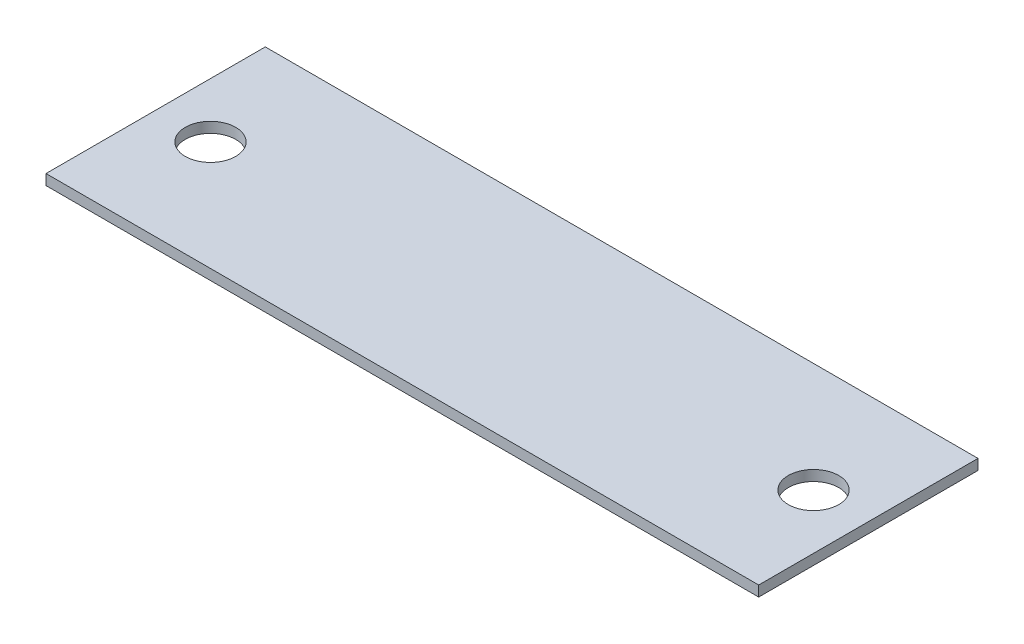
ISO-10303-21;
HEADER;
FILE_DESCRIPTION(('STEP AP214'),'2;1');
FILE_NAME('part.step','',(''),(''),'','','');
FILE_SCHEMA(('AUTOMOTIVE_DESIGN { 1 0 10303 214 1 1 1 1 }'));
ENDSEC;
DATA;
#1=APPLICATION_CONTEXT('core data for automotive mechanical design processes');
#2=APPLICATION_PROTOCOL_DEFINITION('international standard','automotive_design',2000,#1);
#3=PRODUCT_CONTEXT('',#1,'mechanical');
#4=PRODUCT('Part','Part','',(#3));
#5=PRODUCT_RELATED_PRODUCT_CATEGORY('part','',(#4));
#6=PRODUCT_DEFINITION_FORMATION('','',#4);
#7=PRODUCT_DEFINITION_CONTEXT('part definition',#1,'design');
#8=PRODUCT_DEFINITION('design','',#6,#7);
#9=PRODUCT_DEFINITION_SHAPE('','',#8);
#10=(LENGTH_UNIT() NAMED_UNIT(*) SI_UNIT(.MILLI.,.METRE.));
#11=(NAMED_UNIT(*) PLANE_ANGLE_UNIT() SI_UNIT($,.RADIAN.));
#12=(NAMED_UNIT(*) SI_UNIT($,.STERADIAN.) SOLID_ANGLE_UNIT());
#13=UNCERTAINTY_MEASURE_WITH_UNIT(LENGTH_MEASURE(1.E-05),#10,'distance_accuracy_value','');
#14=(GEOMETRIC_REPRESENTATION_CONTEXT(3) GLOBAL_UNCERTAINTY_ASSIGNED_CONTEXT((#13)) GLOBAL_UNIT_ASSIGNED_CONTEXT((#10,
#11,#12)) REPRESENTATION_CONTEXT('',''));
#15=CARTESIAN_POINT('',(0.,0.,0.));
#16=DIRECTION('',(0.,0.,1.));
#17=DIRECTION('',(1.,0.,0.));
#18=AXIS2_PLACEMENT_3D('',#15,#16,#17);
#19=CARTESIAN_POINT('',(0.,1.21412,0.));
#20=DIRECTION('',(0.,1.,0.));
#21=DIRECTION('',(0.,0.,1.));
#22=AXIS2_PLACEMENT_3D('',#19,#20,#21);
#23=PLANE('',#22);
#24=CARTESIAN_POINT('',(-34.925,1.21412,0.));
#25=DIRECTION('',(0.,1.,0.));
#26=DIRECTION('',(0.,0.,1.));
#27=AXIS2_PLACEMENT_3D('',#24,#25,#26);
#28=CIRCLE('',#27,2.921);
#29=CARTESIAN_POINT('',(-34.925,1.21412,2.921));
#30=VERTEX_POINT('',#29);
#31=EDGE_CURVE('E115',#30,#30,#28,.T.);
#32=ORIENTED_EDGE('',*,*,#31,.F.);
#33=EDGE_LOOP('',(#32));
#34=FACE_BOUND('',#33,.T.);
#35=DIRECTION('',(0.,0.,1.));
#36=VECTOR('',#35,1.);
#37=CARTESIAN_POINT('',(-41.275,1.21412,-12.7));
#38=LINE('',#37,#36);
#39=CARTESIAN_POINT('',(-41.275,1.21412,-12.7));
#40=VERTEX_POINT('',#39);
#41=CARTESIAN_POINT('',(-41.275,1.21412,12.7));
#42=VERTEX_POINT('',#41);
#43=EDGE_CURVE('E129',#40,#42,#38,.T.);
#44=ORIENTED_EDGE('',*,*,#43,.T.);
#45=DIRECTION('',(1.,0.,0.));
#46=VECTOR('',#45,1.);
#47=CARTESIAN_POINT('',(-41.275,1.21412,12.7));
#48=LINE('',#47,#46);
#49=CARTESIAN_POINT('',(41.275,1.21412,12.7));
#50=VERTEX_POINT('',#49);
#51=EDGE_CURVE('E77',#42,#50,#48,.T.);
#52=ORIENTED_EDGE('',*,*,#51,.T.);
#53=DIRECTION('',(0.,0.,-1.));
#54=VECTOR('',#53,1.);
#55=CARTESIAN_POINT('',(41.275,1.21412,-12.7));
#56=LINE('',#55,#54);
#57=CARTESIAN_POINT('',(41.275,1.21412,-12.7));
#58=VERTEX_POINT('',#57);
#59=EDGE_CURVE('E141',#50,#58,#56,.T.);
#60=ORIENTED_EDGE('',*,*,#59,.T.);
#61=DIRECTION('',(-1.,0.,0.));
#62=VECTOR('',#61,1.);
#63=CARTESIAN_POINT('',(-41.275,1.21412,-12.7));
#64=LINE('',#63,#62);
#65=EDGE_CURVE('E68',#58,#40,#64,.T.);
#66=ORIENTED_EDGE('',*,*,#65,.T.);
#67=EDGE_LOOP('',(#44,#52,#60,#66));
#68=FACE_BOUND('',#67,.T.);
#69=CARTESIAN_POINT('',(34.925,1.21412,0.));
#70=DIRECTION('',(0.,1.,0.));
#71=DIRECTION('',(0.,0.,1.));
#72=AXIS2_PLACEMENT_3D('',#69,#70,#71);
#73=CIRCLE('',#72,2.921);
#74=CARTESIAN_POINT('',(34.925,1.21412,2.92099999999998));
#75=VERTEX_POINT('',#74);
#76=EDGE_CURVE('E52',#75,#75,#73,.T.);
#77=ORIENTED_EDGE('',*,*,#76,.F.);
#78=EDGE_LOOP('',(#77));
#79=FACE_BOUND('',#78,.T.);
#80=ADVANCED_FACE('F49',(#34,#68,#79),#23,.T.);
#81=CARTESIAN_POINT('',(0.,0.,0.));
#82=DIRECTION('',(0.,1.,0.));
#83=DIRECTION('',(0.,0.,1.));
#84=AXIS2_PLACEMENT_3D('',#81,#82,#83);
#85=PLANE('',#84);
#86=DIRECTION('',(0.,0.,1.));
#87=VECTOR('',#86,1.);
#88=CARTESIAN_POINT('',(-41.275,0.,-12.7));
#89=LINE('',#88,#87);
#90=CARTESIAN_POINT('',(-41.275,0.,-12.7));
#91=VERTEX_POINT('',#90);
#92=CARTESIAN_POINT('',(-41.275,0.,12.7));
#93=VERTEX_POINT('',#92);
#94=EDGE_CURVE('E105',#91,#93,#89,.T.);
#95=ORIENTED_EDGE('',*,*,#94,.F.);
#96=DIRECTION('',(-1.,0.,0.));
#97=VECTOR('',#96,1.);
#98=CARTESIAN_POINT('',(-41.275,0.,-12.7));
#99=LINE('',#98,#97);
#100=CARTESIAN_POINT('',(41.275,0.,-12.7));
#101=VERTEX_POINT('',#100);
#102=EDGE_CURVE('E85',#101,#91,#99,.T.);
#103=ORIENTED_EDGE('',*,*,#102,.F.);
#104=DIRECTION('',(0.,0.,-1.));
#105=VECTOR('',#104,1.);
#106=CARTESIAN_POINT('',(41.275,0.,-12.7));
#107=LINE('',#106,#105);
#108=CARTESIAN_POINT('',(41.275,0.,12.7));
#109=VERTEX_POINT('',#108);
#110=EDGE_CURVE('E93',#109,#101,#107,.T.);
#111=ORIENTED_EDGE('',*,*,#110,.F.);
#112=DIRECTION('',(1.,0.,0.));
#113=VECTOR('',#112,1.);
#114=CARTESIAN_POINT('',(-41.275,0.,12.7));
#115=LINE('',#114,#113);
#116=EDGE_CURVE('E101',#93,#109,#115,.T.);
#117=ORIENTED_EDGE('',*,*,#116,.F.);
#118=EDGE_LOOP('',(#95,#103,#111,#117));
#119=FACE_BOUND('',#118,.T.);
#120=CARTESIAN_POINT('',(-34.925,0.,0.));
#121=DIRECTION('',(0.,1.,0.));
#122=DIRECTION('',(0.,0.,1.));
#123=AXIS2_PLACEMENT_3D('',#120,#121,#122);
#124=CIRCLE('',#123,2.921);
#125=CARTESIAN_POINT('',(-34.925,0.,2.921));
#126=VERTEX_POINT('',#125);
#127=EDGE_CURVE('E121',#126,#126,#124,.T.);
#128=ORIENTED_EDGE('',*,*,#127,.T.);
#129=EDGE_LOOP('',(#128));
#130=FACE_BOUND('',#129,.T.);
#131=CARTESIAN_POINT('',(34.925,0.,0.));
#132=DIRECTION('',(0.,1.,0.));
#133=DIRECTION('',(0.,0.,1.));
#134=AXIS2_PLACEMENT_3D('',#131,#132,#133);
#135=CIRCLE('',#134,2.921);
#136=CARTESIAN_POINT('',(34.925,0.,2.92099999999998));
#137=VERTEX_POINT('',#136);
#138=EDGE_CURVE('E148',#137,#137,#135,.T.);
#139=ORIENTED_EDGE('',*,*,#138,.T.);
#140=EDGE_LOOP('',(#139));
#141=FACE_BOUND('',#140,.T.);
#142=ADVANCED_FACE('F102',(#119,#130,#141),#85,.F.);
#143=CARTESIAN_POINT('',(-41.275,1.1176,-12.7));
#144=DIRECTION('',(1.,0.,0.));
#145=DIRECTION('',(0.,0.,-1.));
#146=AXIS2_PLACEMENT_3D('',#143,#144,#145);
#147=PLANE('',#146);
#148=ORIENTED_EDGE('',*,*,#94,.T.);
#149=DIRECTION('',(0.,-1.,0.));
#150=VECTOR('',#149,1.);
#151=CARTESIAN_POINT('',(-41.275,1.1176,12.7));
#152=LINE('',#151,#150);
#153=EDGE_CURVE('E14',#42,#93,#152,.T.);
#154=ORIENTED_EDGE('',*,*,#153,.F.);
#155=ORIENTED_EDGE('',*,*,#43,.F.);
#156=DIRECTION('',(0.,-1.,0.));
#157=VECTOR('',#156,1.);
#158=CARTESIAN_POINT('',(-41.275,1.1176,-12.7));
#159=LINE('',#158,#157);
#160=EDGE_CURVE('E113',#40,#91,#159,.T.);
#161=ORIENTED_EDGE('',*,*,#160,.T.);
#162=EDGE_LOOP('',(#148,#154,#155,#161));
#163=FACE_BOUND('',#162,.T.);
#164=ADVANCED_FACE('F112',(#163),#147,.F.);
#165=CARTESIAN_POINT('',(-41.275,1.1176,12.7));
#166=DIRECTION('',(0.,0.,-1.));
#167=DIRECTION('',(-1.,0.,0.));
#168=AXIS2_PLACEMENT_3D('',#165,#166,#167);
#169=PLANE('',#168);
#170=ORIENTED_EDGE('',*,*,#116,.T.);
#171=DIRECTION('',(0.,-1.,0.));
#172=VECTOR('',#171,1.);
#173=CARTESIAN_POINT('',(41.275,1.1176,12.7));
#174=LINE('',#173,#172);
#175=EDGE_CURVE('E59',#50,#109,#174,.T.);
#176=ORIENTED_EDGE('',*,*,#175,.F.);
#177=ORIENTED_EDGE('',*,*,#51,.F.);
#178=ORIENTED_EDGE('',*,*,#153,.T.);
#179=EDGE_LOOP('',(#170,#176,#177,#178));
#180=FACE_BOUND('',#179,.T.);
#181=ADVANCED_FACE('F109',(#180),#169,.F.);
#182=CARTESIAN_POINT('',(41.275,1.1176,-12.7));
#183=DIRECTION('',(-1.,0.,0.));
#184=DIRECTION('',(0.,0.,1.));
#185=AXIS2_PLACEMENT_3D('',#182,#183,#184);
#186=PLANE('',#185);
#187=ORIENTED_EDGE('',*,*,#110,.T.);
#188=DIRECTION('',(0.,-1.,0.));
#189=VECTOR('',#188,1.);
#190=CARTESIAN_POINT('',(41.275,1.1176,-12.7));
#191=LINE('',#190,#189);
#192=EDGE_CURVE('E132',#58,#101,#191,.T.);
#193=ORIENTED_EDGE('',*,*,#192,.F.);
#194=ORIENTED_EDGE('',*,*,#59,.F.);
#195=ORIENTED_EDGE('',*,*,#175,.T.);
#196=EDGE_LOOP('',(#187,#193,#194,#195));
#197=FACE_BOUND('',#196,.T.);
#198=ADVANCED_FACE('F181',(#197),#186,.F.);
#199=CARTESIAN_POINT('',(-41.275,1.1176,-12.7));
#200=DIRECTION('',(0.,0.,1.));
#201=DIRECTION('',(1.,0.,0.));
#202=AXIS2_PLACEMENT_3D('',#199,#200,#201);
#203=PLANE('',#202);
#204=ORIENTED_EDGE('',*,*,#102,.T.);
#205=ORIENTED_EDGE('',*,*,#160,.F.);
#206=ORIENTED_EDGE('',*,*,#65,.F.);
#207=ORIENTED_EDGE('',*,*,#192,.T.);
#208=EDGE_LOOP('',(#204,#205,#206,#207));
#209=FACE_BOUND('',#208,.T.);
#210=ADVANCED_FACE('F163',(#209),#203,.F.);
#211=CARTESIAN_POINT('',(-34.925,1.1176,0.));
#212=DIRECTION('',(0.,-1.,0.));
#213=DIRECTION('',(0.,0.,-1.));
#214=AXIS2_PLACEMENT_3D('',#211,#212,#213);
#215=CYLINDRICAL_SURFACE('',#214,2.921);
#216=ORIENTED_EDGE('',*,*,#31,.T.);
#217=EDGE_LOOP('',(#216));
#218=FACE_BOUND('',#217,.T.);
#219=ORIENTED_EDGE('',*,*,#127,.F.);
#220=EDGE_LOOP('',(#219));
#221=FACE_BOUND('',#220,.T.);
#222=ADVANCED_FACE('F158',(#218,#221),#215,.F.);
#223=CARTESIAN_POINT('',(34.925,1.1176,0.));
#224=DIRECTION('',(0.,-1.,0.));
#225=DIRECTION('',(0.,0.,-1.));
#226=AXIS2_PLACEMENT_3D('',#223,#224,#225);
#227=CYLINDRICAL_SURFACE('',#226,2.921);
#228=ORIENTED_EDGE('',*,*,#76,.T.);
#229=EDGE_LOOP('',(#228));
#230=FACE_BOUND('',#229,.T.);
#231=ORIENTED_EDGE('',*,*,#138,.F.);
#232=EDGE_LOOP('',(#231));
#233=FACE_BOUND('',#232,.T.);
#234=ADVANCED_FACE('F156',(#230,#233),#227,.F.);
#235=CLOSED_SHELL('',(#80,#142,#164,#181,#198,#210,#222,#234));
#236=MANIFOLD_SOLID_BREP('B2',#235);
#237=ADVANCED_BREP_SHAPE_REPRESENTATION('',(#18,#236),#14);
#238=SHAPE_DEFINITION_REPRESENTATION(#9,#237);
ENDSEC;
END-ISO-10303-21;
